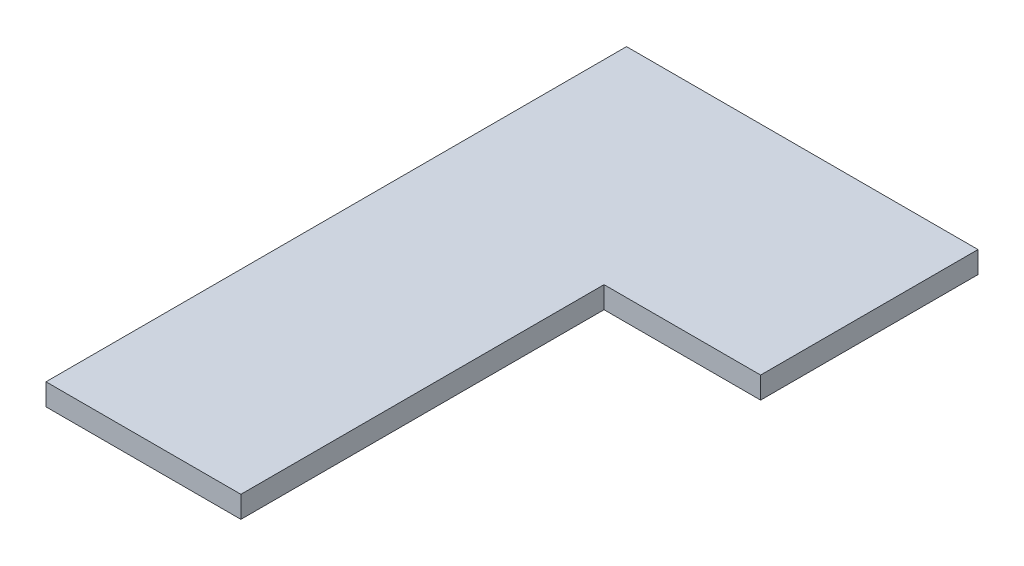
ISO-10303-21;
HEADER;
FILE_DESCRIPTION(('STEP AP214'),'2;1');
FILE_NAME('part.step','',(''),(''),'','','');
FILE_SCHEMA(('AUTOMOTIVE_DESIGN { 1 0 10303 214 1 1 1 1 }'));
ENDSEC;
DATA;
#1=APPLICATION_CONTEXT('core data for automotive mechanical design processes');
#2=APPLICATION_PROTOCOL_DEFINITION('international standard','automotive_design',2000,#1);
#3=PRODUCT_CONTEXT('',#1,'mechanical');
#4=PRODUCT('Part','Part','',(#3));
#5=PRODUCT_RELATED_PRODUCT_CATEGORY('part','',(#4));
#6=PRODUCT_DEFINITION_FORMATION('','',#4);
#7=PRODUCT_DEFINITION_CONTEXT('part definition',#1,'design');
#8=PRODUCT_DEFINITION('design','',#6,#7);
#9=PRODUCT_DEFINITION_SHAPE('','',#8);
#10=(LENGTH_UNIT() NAMED_UNIT(*) SI_UNIT(.MILLI.,.METRE.));
#11=(NAMED_UNIT(*) PLANE_ANGLE_UNIT() SI_UNIT($,.RADIAN.));
#12=(NAMED_UNIT(*) SI_UNIT($,.STERADIAN.) SOLID_ANGLE_UNIT());
#13=UNCERTAINTY_MEASURE_WITH_UNIT(LENGTH_MEASURE(1.E-05),#10,'distance_accuracy_value','');
#14=(GEOMETRIC_REPRESENTATION_CONTEXT(3) GLOBAL_UNCERTAINTY_ASSIGNED_CONTEXT((#13)) GLOBAL_UNIT_ASSIGNED_CONTEXT((#10,
#11,#12)) REPRESENTATION_CONTEXT('',''));
#15=CARTESIAN_POINT('',(0.,0.,0.));
#16=DIRECTION('',(0.,0.,1.));
#17=DIRECTION('',(1.,0.,0.));
#18=AXIS2_PLACEMENT_3D('',#15,#16,#17);
#19=CARTESIAN_POINT('',(0.,3.,30.));
#20=DIRECTION('',(-1.,0.,0.));
#21=DIRECTION('',(0.,0.,1.));
#22=AXIS2_PLACEMENT_3D('',#19,#20,#21);
#23=PLANE('',#22);
#24=DIRECTION('',(0.,0.,-1.));
#25=VECTOR('',#24,1.);
#26=CARTESIAN_POINT('',(0.,0.,30.));
#27=LINE('',#26,#25);
#28=CARTESIAN_POINT('',(0.,0.,30.));
#29=VERTEX_POINT('',#28);
#30=CARTESIAN_POINT('',(0.,0.,0.));
#31=VERTEX_POINT('',#30);
#32=EDGE_CURVE('E122',#29,#31,#27,.T.);
#33=ORIENTED_EDGE('',*,*,#32,.T.);
#34=DIRECTION('',(0.,-1.,0.));
#35=VECTOR('',#34,1.);
#36=CARTESIAN_POINT('',(0.,3.,0.));
#37=LINE('',#36,#35);
#38=CARTESIAN_POINT('',(0.,3.,0.));
#39=VERTEX_POINT('',#38);
#40=EDGE_CURVE('E11',#39,#31,#37,.T.);
#41=ORIENTED_EDGE('',*,*,#40,.F.);
#42=DIRECTION('',(0.,0.,-1.));
#43=VECTOR('',#42,1.);
#44=CARTESIAN_POINT('',(0.,3.,30.));
#45=LINE('',#44,#43);
#46=CARTESIAN_POINT('',(0.,3.,30.));
#47=VERTEX_POINT('',#46);
#48=EDGE_CURVE('E133',#47,#39,#45,.T.);
#49=ORIENTED_EDGE('',*,*,#48,.F.);
#50=DIRECTION('',(0.,-1.,0.));
#51=VECTOR('',#50,1.);
#52=CARTESIAN_POINT('',(0.,3.,30.));
#53=LINE('',#52,#51);
#54=EDGE_CURVE('E119',#47,#29,#53,.T.);
#55=ORIENTED_EDGE('',*,*,#54,.T.);
#56=EDGE_LOOP('',(#33,#41,#49,#55));
#57=FACE_BOUND('',#56,.T.);
#58=ADVANCED_FACE('F37',(#57),#23,.F.);
#59=CARTESIAN_POINT('',(0.,3.,0.));
#60=DIRECTION('',(0.,0.,1.));
#61=DIRECTION('',(1.,0.,0.));
#62=AXIS2_PLACEMENT_3D('',#59,#60,#61);
#63=PLANE('',#62);
#64=DIRECTION('',(-1.,0.,0.));
#65=VECTOR('',#64,1.);
#66=CARTESIAN_POINT('',(0.,0.,0.));
#67=LINE('',#66,#65);
#68=CARTESIAN_POINT('',(-48.5057471264368,0.,0.));
#69=VERTEX_POINT('',#68);
#70=EDGE_CURVE('E130',#31,#69,#67,.T.);
#71=ORIENTED_EDGE('',*,*,#70,.T.);
#72=DIRECTION('',(0.,-1.,0.));
#73=VECTOR('',#72,1.);
#74=CARTESIAN_POINT('',(-48.5057471264368,3.,0.));
#75=LINE('',#74,#73);
#76=CARTESIAN_POINT('',(-48.5057471264368,3.,0.));
#77=VERTEX_POINT('',#76);
#78=EDGE_CURVE('E48',#77,#69,#75,.T.);
#79=ORIENTED_EDGE('',*,*,#78,.F.);
#80=DIRECTION('',(-1.,0.,0.));
#81=VECTOR('',#80,1.);
#82=CARTESIAN_POINT('',(0.,3.,0.));
#83=LINE('',#82,#81);
#84=EDGE_CURVE('E91',#39,#77,#83,.T.);
#85=ORIENTED_EDGE('',*,*,#84,.F.);
#86=ORIENTED_EDGE('',*,*,#40,.T.);
#87=EDGE_LOOP('',(#71,#79,#85,#86));
#88=FACE_BOUND('',#87,.T.);
#89=ADVANCED_FACE('F158',(#88),#63,.F.);
#90=CARTESIAN_POINT('',(-48.5057471264368,3.,0.));
#91=DIRECTION('',(1.,0.,0.));
#92=DIRECTION('',(0.,0.,-1.));
#93=AXIS2_PLACEMENT_3D('',#90,#91,#92);
#94=PLANE('',#93);
#95=DIRECTION('',(0.,0.,1.));
#96=VECTOR('',#95,1.);
#97=CARTESIAN_POINT('',(-48.5057471264368,0.,0.));
#98=LINE('',#97,#96);
#99=CARTESIAN_POINT('',(-48.5057471264368,0.,80.1149425287357));
#100=VERTEX_POINT('',#99);
#101=EDGE_CURVE('E129',#69,#100,#98,.T.);
#102=ORIENTED_EDGE('',*,*,#101,.T.);
#103=DIRECTION('',(0.,-1.,0.));
#104=VECTOR('',#103,1.);
#105=CARTESIAN_POINT('',(-48.5057471264368,3.,80.1149425287357));
#106=LINE('',#105,#104);
#107=CARTESIAN_POINT('',(-48.5057471264368,3.,80.1149425287357));
#108=VERTEX_POINT('',#107);
#109=EDGE_CURVE('E113',#108,#100,#106,.T.);
#110=ORIENTED_EDGE('',*,*,#109,.F.);
#111=DIRECTION('',(0.,0.,1.));
#112=VECTOR('',#111,1.);
#113=CARTESIAN_POINT('',(-48.5057471264368,3.,0.));
#114=LINE('',#113,#112);
#115=EDGE_CURVE('E106',#77,#108,#114,.T.);
#116=ORIENTED_EDGE('',*,*,#115,.F.);
#117=ORIENTED_EDGE('',*,*,#78,.T.);
#118=EDGE_LOOP('',(#102,#110,#116,#117));
#119=FACE_BOUND('',#118,.T.);
#120=ADVANCED_FACE('F138',(#119),#94,.F.);
#121=CARTESIAN_POINT('',(-48.5057471264368,3.,80.1149425287357));
#122=DIRECTION('',(0.,0.,-1.));
#123=DIRECTION('',(-1.,0.,0.));
#124=AXIS2_PLACEMENT_3D('',#121,#122,#123);
#125=PLANE('',#124);
#126=DIRECTION('',(1.,0.,0.));
#127=VECTOR('',#126,1.);
#128=CARTESIAN_POINT('',(-48.5057471264368,0.,80.1149425287357));
#129=LINE('',#128,#127);
#130=CARTESIAN_POINT('',(-21.6091954022988,0.,80.1149425287357));
#131=VERTEX_POINT('',#130);
#132=EDGE_CURVE('E111',#100,#131,#129,.T.);
#133=ORIENTED_EDGE('',*,*,#132,.T.);
#134=DIRECTION('',(0.,-1.,0.));
#135=VECTOR('',#134,1.);
#136=CARTESIAN_POINT('',(-21.6091954022988,3.,80.1149425287357));
#137=LINE('',#136,#135);
#138=CARTESIAN_POINT('',(-21.6091954022988,3.,80.1149425287357));
#139=VERTEX_POINT('',#138);
#140=EDGE_CURVE('E112',#139,#131,#137,.T.);
#141=ORIENTED_EDGE('',*,*,#140,.F.);
#142=DIRECTION('',(1.,0.,0.));
#143=VECTOR('',#142,1.);
#144=CARTESIAN_POINT('',(-48.5057471264368,3.,80.1149425287357));
#145=LINE('',#144,#143);
#146=EDGE_CURVE('E99',#108,#139,#145,.T.);
#147=ORIENTED_EDGE('',*,*,#146,.F.);
#148=ORIENTED_EDGE('',*,*,#109,.T.);
#149=EDGE_LOOP('',(#133,#141,#147,#148));
#150=FACE_BOUND('',#149,.T.);
#151=ADVANCED_FACE('F115',(#150),#125,.F.);
#152=CARTESIAN_POINT('',(-21.6091954022988,3.,80.1149425287357));
#153=DIRECTION('',(-1.,0.,0.));
#154=DIRECTION('',(0.,0.,1.));
#155=AXIS2_PLACEMENT_3D('',#152,#153,#154);
#156=PLANE('',#155);
#157=DIRECTION('',(0.,0.,-1.));
#158=VECTOR('',#157,1.);
#159=CARTESIAN_POINT('',(-21.6091954022988,0.,80.1149425287357));
#160=LINE('',#159,#158);
#161=CARTESIAN_POINT('',(-21.6091954022988,0.,30.));
#162=VERTEX_POINT('',#161);
#163=EDGE_CURVE('E78',#131,#162,#160,.T.);
#164=ORIENTED_EDGE('',*,*,#163,.T.);
#165=DIRECTION('',(0.,-1.,0.));
#166=VECTOR('',#165,1.);
#167=CARTESIAN_POINT('',(-21.6091954022988,3.,30.));
#168=LINE('',#167,#166);
#169=CARTESIAN_POINT('',(-21.6091954022988,3.,30.));
#170=VERTEX_POINT('',#169);
#171=EDGE_CURVE('E116',#170,#162,#168,.T.);
#172=ORIENTED_EDGE('',*,*,#171,.F.);
#173=DIRECTION('',(0.,0.,-1.));
#174=VECTOR('',#173,1.);
#175=CARTESIAN_POINT('',(-21.6091954022988,3.,80.1149425287357));
#176=LINE('',#175,#174);
#177=EDGE_CURVE('E102',#139,#170,#176,.T.);
#178=ORIENTED_EDGE('',*,*,#177,.F.);
#179=ORIENTED_EDGE('',*,*,#140,.T.);
#180=EDGE_LOOP('',(#164,#172,#178,#179));
#181=FACE_BOUND('',#180,.T.);
#182=ADVANCED_FACE('F117',(#181),#156,.F.);
#183=CARTESIAN_POINT('',(-21.6091954022988,3.,30.));
#184=DIRECTION('',(0.,0.,-1.));
#185=DIRECTION('',(-1.,0.,0.));
#186=AXIS2_PLACEMENT_3D('',#183,#184,#185);
#187=PLANE('',#186);
#188=DIRECTION('',(1.,0.,0.));
#189=VECTOR('',#188,1.);
#190=CARTESIAN_POINT('',(-21.6091954022988,0.,30.));
#191=LINE('',#190,#189);
#192=EDGE_CURVE('E83',#162,#29,#191,.T.);
#193=ORIENTED_EDGE('',*,*,#192,.T.);
#194=ORIENTED_EDGE('',*,*,#54,.F.);
#195=DIRECTION('',(1.,0.,0.));
#196=VECTOR('',#195,1.);
#197=CARTESIAN_POINT('',(-21.6091954022988,3.,30.));
#198=LINE('',#197,#196);
#199=EDGE_CURVE('E57',#170,#47,#198,.T.);
#200=ORIENTED_EDGE('',*,*,#199,.F.);
#201=ORIENTED_EDGE('',*,*,#171,.T.);
#202=EDGE_LOOP('',(#193,#194,#200,#201));
#203=FACE_BOUND('',#202,.T.);
#204=ADVANCED_FACE('F150',(#203),#187,.F.);
#205=CARTESIAN_POINT('',(0.,3.,0.));
#206=DIRECTION('',(0.,1.,0.));
#207=DIRECTION('',(0.,0.,1.));
#208=AXIS2_PLACEMENT_3D('',#205,#206,#207);
#209=PLANE('',#208);
#210=ORIENTED_EDGE('',*,*,#48,.T.);
#211=ORIENTED_EDGE('',*,*,#84,.T.);
#212=ORIENTED_EDGE('',*,*,#115,.T.);
#213=ORIENTED_EDGE('',*,*,#146,.T.);
#214=ORIENTED_EDGE('',*,*,#177,.T.);
#215=ORIENTED_EDGE('',*,*,#199,.T.);
#216=EDGE_LOOP('',(#210,#211,#212,#213,#214,#215));
#217=FACE_BOUND('',#216,.T.);
#218=ADVANCED_FACE('F105',(#217),#209,.T.);
#219=CARTESIAN_POINT('',(0.,0.,0.));
#220=DIRECTION('',(0.,1.,0.));
#221=DIRECTION('',(0.,0.,1.));
#222=AXIS2_PLACEMENT_3D('',#219,#220,#221);
#223=PLANE('',#222);
#224=ORIENTED_EDGE('',*,*,#32,.F.);
#225=ORIENTED_EDGE('',*,*,#192,.F.);
#226=ORIENTED_EDGE('',*,*,#163,.F.);
#227=ORIENTED_EDGE('',*,*,#132,.F.);
#228=ORIENTED_EDGE('',*,*,#101,.F.);
#229=ORIENTED_EDGE('',*,*,#70,.F.);
#230=EDGE_LOOP('',(#224,#225,#226,#227,#228,#229));
#231=FACE_BOUND('',#230,.T.);
#232=ADVANCED_FACE('F141',(#231),#223,.F.);
#233=CLOSED_SHELL('',(#58,#89,#120,#151,#182,#204,#218,#232));
#234=MANIFOLD_SOLID_BREP('B2',#233);
#235=ADVANCED_BREP_SHAPE_REPRESENTATION('',(#18,#234),#14);
#236=SHAPE_DEFINITION_REPRESENTATION(#9,#235);
ENDSEC;
END-ISO-10303-21;
